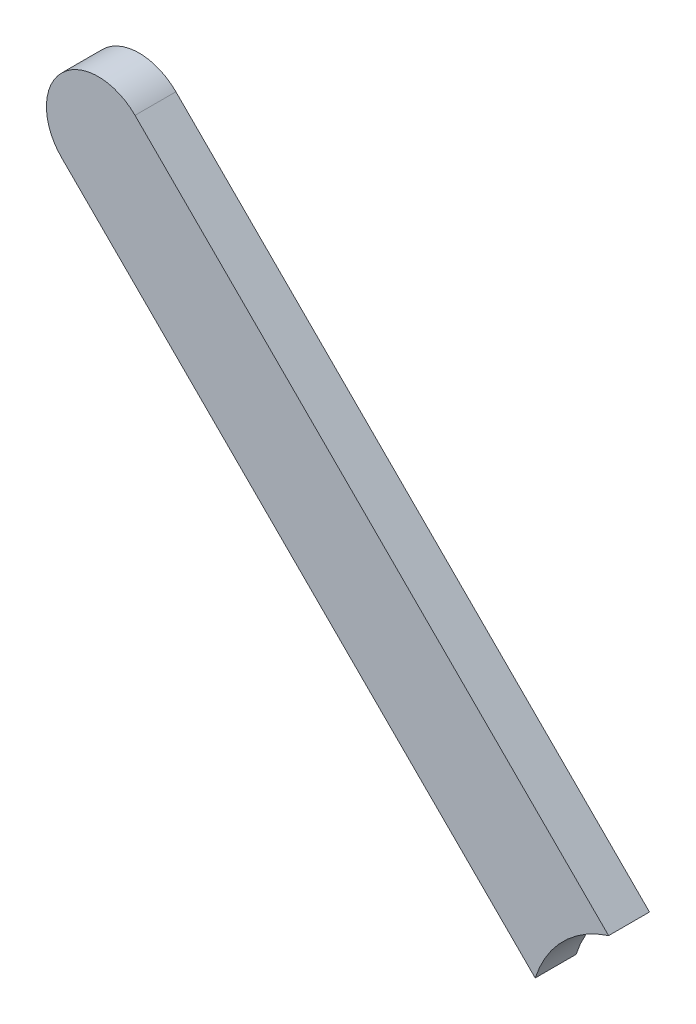
ISO-10303-21;
HEADER;
FILE_DESCRIPTION(('STEP AP214'),'2;1');
FILE_NAME('part.step','',(''),(''),'','','');
FILE_SCHEMA(('AUTOMOTIVE_DESIGN { 1 0 10303 214 1 1 1 1 }'));
ENDSEC;
DATA;
#1=APPLICATION_CONTEXT('core data for automotive mechanical design processes');
#2=APPLICATION_PROTOCOL_DEFINITION('international standard','automotive_design',2000,#1);
#3=PRODUCT_CONTEXT('',#1,'mechanical');
#4=PRODUCT('Part','Part','',(#3));
#5=PRODUCT_RELATED_PRODUCT_CATEGORY('part','',(#4));
#6=PRODUCT_DEFINITION_FORMATION('','',#4);
#7=PRODUCT_DEFINITION_CONTEXT('part definition',#1,'design');
#8=PRODUCT_DEFINITION('design','',#6,#7);
#9=PRODUCT_DEFINITION_SHAPE('','',#8);
#10=(LENGTH_UNIT() NAMED_UNIT(*) SI_UNIT(.MILLI.,.METRE.));
#11=(NAMED_UNIT(*) PLANE_ANGLE_UNIT() SI_UNIT($,.RADIAN.));
#12=(NAMED_UNIT(*) SI_UNIT($,.STERADIAN.) SOLID_ANGLE_UNIT());
#13=UNCERTAINTY_MEASURE_WITH_UNIT(LENGTH_MEASURE(1.E-05),#10,'distance_accuracy_value','');
#14=(GEOMETRIC_REPRESENTATION_CONTEXT(3) GLOBAL_UNCERTAINTY_ASSIGNED_CONTEXT((#13)) GLOBAL_UNIT_ASSIGNED_CONTEXT((#10,
#11,#12)) REPRESENTATION_CONTEXT('',''));
#15=CARTESIAN_POINT('',(0.,0.,0.));
#16=DIRECTION('',(0.,0.,1.));
#17=DIRECTION('',(1.,0.,0.));
#18=AXIS2_PLACEMENT_3D('',#15,#16,#17);
#19=CARTESIAN_POINT('',(146.12439406,106.11639686,0.));
#20=DIRECTION('',(0.70710678118655,0.707106781186546,0.));
#21=DIRECTION('',(0.707106781186546,-0.70710678118655,0.));
#22=AXIS2_PLACEMENT_3D('',#19,#20,#21);
#23=PLANE('',#22);
#24=DIRECTION('',(0.707106781186546,-0.707106781186549,0.));
#25=VECTOR('',#24,1.);
#26=CARTESIAN_POINT('',(146.12439406,106.11639686,0.1999996));
#27=LINE('',#26,#25);
#28=CARTESIAN_POINT('',(146.12439406,106.11639686,0.1999996));
#29=VERTEX_POINT('',#28);
#30=CARTESIAN_POINT('',(148.442460978856,103.798329941144,0.1999996));
#31=VERTEX_POINT('',#30);
#32=EDGE_CURVE('E11',#29,#31,#27,.T.);
#33=ORIENTED_EDGE('',*,*,#32,.F.);
#34=DIRECTION('',(0.,0.,1.));
#35=VECTOR('',#34,1.);
#36=CARTESIAN_POINT('',(146.12439406,106.11639686,0.));
#37=LINE('',#36,#35);
#38=CARTESIAN_POINT('',(146.12439406,106.11639686,0.));
#39=VERTEX_POINT('',#38);
#40=EDGE_CURVE('E24',#39,#29,#37,.T.);
#41=ORIENTED_EDGE('',*,*,#40,.F.);
#42=DIRECTION('',(0.707106781186546,-0.707106781186549,0.));
#43=VECTOR('',#42,1.);
#44=CARTESIAN_POINT('',(146.12439406,106.11639686,0.));
#45=LINE('',#44,#43);
#46=CARTESIAN_POINT('',(148.442460978856,103.798329941144,0.));
#47=VERTEX_POINT('',#46);
#48=EDGE_CURVE('E75',#39,#47,#45,.T.);
#49=ORIENTED_EDGE('',*,*,#48,.T.);
#50=DIRECTION('',(0.,0.,1.));
#51=VECTOR('',#50,1.);
#52=CARTESIAN_POINT('',(148.442460978856,103.798329941144,0.));
#53=LINE('',#52,#51);
#54=EDGE_CURVE('E37',#47,#31,#53,.T.);
#55=ORIENTED_EDGE('',*,*,#54,.T.);
#56=EDGE_LOOP('',(#33,#41,#49,#55));
#57=FACE_BOUND('',#56,.T.);
#58=ADVANCED_FACE('F17',(#57),#23,.F.);
#59=CARTESIAN_POINT('',(148.971,103.6290028,0.));
#60=DIRECTION('',(0.,0.,-1.));
#61=DIRECTION('',(1.,0.,0.));
#62=AXIS2_PLACEMENT_3D('',#59,#60,#61);
#63=CYLINDRICAL_SURFACE('',#62,0.55500016);
#64=DIRECTION('',(0.,0.,1.));
#65=VECTOR('',#64,1.);
#66=CARTESIAN_POINT('',(148.801672858856,104.157541821144,0.));
#67=LINE('',#66,#65);
#68=CARTESIAN_POINT('',(148.801672858856,104.157541821144,0.));
#69=VERTEX_POINT('',#68);
#70=CARTESIAN_POINT('',(148.801672858856,104.157541821144,0.1999996));
#71=VERTEX_POINT('',#70);
#72=EDGE_CURVE('E67',#69,#71,#67,.T.);
#73=ORIENTED_EDGE('',*,*,#72,.T.);
#74=CARTESIAN_POINT('',(148.971,103.6290028,0.1999996));
#75=DIRECTION('',(0.,0.,1.));
#76=DIRECTION('',(1.,0.,0.));
#77=AXIS2_PLACEMENT_3D('',#74,#75,#76);
#78=CIRCLE('',#77,0.55500016);
#79=EDGE_CURVE('E82',#71,#31,#78,.T.);
#80=ORIENTED_EDGE('',*,*,#79,.T.);
#81=ORIENTED_EDGE('',*,*,#54,.F.);
#82=CARTESIAN_POINT('',(148.971,103.6290028,0.));
#83=DIRECTION('',(0.,0.,1.));
#84=DIRECTION('',(1.,0.,0.));
#85=AXIS2_PLACEMENT_3D('',#82,#83,#84);
#86=CIRCLE('',#85,0.55500016);
#87=EDGE_CURVE('E80',#69,#47,#86,.T.);
#88=ORIENTED_EDGE('',*,*,#87,.F.);
#89=EDGE_LOOP('',(#73,#80,#81,#88));
#90=FACE_BOUND('',#89,.T.);
#91=ADVANCED_FACE('F88',(#90),#63,.F.);
#92=CARTESIAN_POINT('',(148.801672858856,104.157541821144,0.));
#93=DIRECTION('',(-0.707106781186546,-0.70710678118655,0.));
#94=DIRECTION('',(-0.70710678118655,0.707106781186546,0.));
#95=AXIS2_PLACEMENT_3D('',#92,#93,#94);
#96=PLANE('',#95);
#97=DIRECTION('',(-0.70710678118655,0.707106781186546,0.));
#98=VECTOR('',#97,1.);
#99=CARTESIAN_POINT('',(149.15060594,103.80860874,0.1999996));
#100=LINE('',#99,#98);
#101=CARTESIAN_POINT('',(146.48360594,106.47560874,0.1999996));
#102=VERTEX_POINT('',#101);
#103=EDGE_CURVE('E71',#71,#102,#100,.T.);
#104=ORIENTED_EDGE('',*,*,#103,.F.);
#105=ORIENTED_EDGE('',*,*,#72,.F.);
#106=DIRECTION('',(-0.70710678118655,0.707106781186546,0.));
#107=VECTOR('',#106,1.);
#108=CARTESIAN_POINT('',(149.15060594,103.80860874,0.));
#109=LINE('',#108,#107);
#110=CARTESIAN_POINT('',(146.48360594,106.47560874,0.));
#111=VERTEX_POINT('',#110);
#112=EDGE_CURVE('E63',#69,#111,#109,.T.);
#113=ORIENTED_EDGE('',*,*,#112,.T.);
#114=DIRECTION('',(0.,0.,1.));
#115=VECTOR('',#114,1.);
#116=CARTESIAN_POINT('',(146.48360594,106.47560874,0.));
#117=LINE('',#116,#115);
#118=EDGE_CURVE('E53',#111,#102,#117,.T.);
#119=ORIENTED_EDGE('',*,*,#118,.T.);
#120=EDGE_LOOP('',(#104,#105,#113,#119));
#121=FACE_BOUND('',#120,.T.);
#122=ADVANCED_FACE('F66',(#121),#96,.F.);
#123=CARTESIAN_POINT('',(146.304,106.2960028,0.));
#124=DIRECTION('',(0.,0.,-1.));
#125=DIRECTION('',(0.707106781186604,0.707106781186492,0.));
#126=AXIS2_PLACEMENT_3D('',#123,#124,#125);
#127=CYLINDRICAL_SURFACE('',#126,0.254001156230758);
#128=CARTESIAN_POINT('',(146.304,106.2960028,0.1999996));
#129=DIRECTION('',(0.,0.,1.));
#130=DIRECTION('',(0.707106781186604,0.707106781186492,0.));
#131=AXIS2_PLACEMENT_3D('',#128,#129,#130);
#132=CIRCLE('',#131,0.254001156230758);
#133=EDGE_CURVE('E59',#102,#29,#132,.T.);
#134=ORIENTED_EDGE('',*,*,#133,.F.);
#135=ORIENTED_EDGE('',*,*,#118,.F.);
#136=CARTESIAN_POINT('',(146.304,106.2960028,0.));
#137=DIRECTION('',(0.,0.,1.));
#138=DIRECTION('',(0.707106781186604,0.707106781186492,0.));
#139=AXIS2_PLACEMENT_3D('',#136,#137,#138);
#140=CIRCLE('',#139,0.254001156230758);
#141=EDGE_CURVE('E57',#111,#39,#140,.T.);
#142=ORIENTED_EDGE('',*,*,#141,.T.);
#143=ORIENTED_EDGE('',*,*,#40,.T.);
#144=EDGE_LOOP('',(#134,#135,#142,#143));
#145=FACE_BOUND('',#144,.T.);
#146=ADVANCED_FACE('F55',(#145),#127,.T.);
#147=CARTESIAN_POINT('',(146.12439406,106.11639686,0.));
#148=DIRECTION('',(0.,0.,-1.));
#149=DIRECTION('',(-1.,0.,0.));
#150=AXIS2_PLACEMENT_3D('',#147,#148,#149);
#151=PLANE('',#150);
#152=ORIENTED_EDGE('',*,*,#48,.F.);
#153=ORIENTED_EDGE('',*,*,#141,.F.);
#154=ORIENTED_EDGE('',*,*,#112,.F.);
#155=ORIENTED_EDGE('',*,*,#87,.T.);
#156=EDGE_LOOP('',(#152,#153,#154,#155));
#157=FACE_BOUND('',#156,.T.);
#158=ADVANCED_FACE('F74',(#157),#151,.T.);
#159=CARTESIAN_POINT('',(146.12439406,106.11639686,0.1999996));
#160=DIRECTION('',(0.,0.,-1.));
#161=DIRECTION('',(-1.,0.,0.));
#162=AXIS2_PLACEMENT_3D('',#159,#160,#161);
#163=PLANE('',#162);
#164=ORIENTED_EDGE('',*,*,#133,.T.);
#165=ORIENTED_EDGE('',*,*,#32,.T.);
#166=ORIENTED_EDGE('',*,*,#79,.F.);
#167=ORIENTED_EDGE('',*,*,#103,.T.);
#168=EDGE_LOOP('',(#164,#165,#166,#167));
#169=FACE_BOUND('',#168,.T.);
#170=ADVANCED_FACE('F91',(#169),#163,.F.);
#171=CLOSED_SHELL('',(#58,#91,#122,#146,#158,#170));
#172=MANIFOLD_SOLID_BREP('B1',#171);
#173=ADVANCED_BREP_SHAPE_REPRESENTATION('',(#18,#172),#14);
#174=SHAPE_DEFINITION_REPRESENTATION(#9,#173);
ENDSEC;
END-ISO-10303-21;
